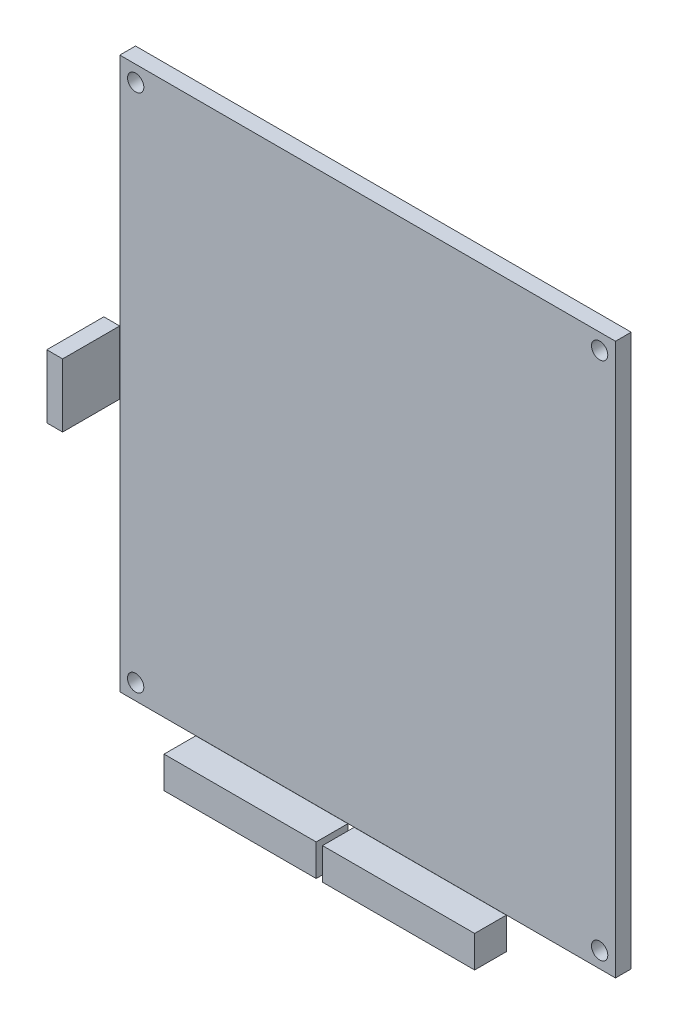
ISO-10303-21;
HEADER;
FILE_DESCRIPTION(('STEP AP214'),'2;1');
FILE_NAME('part.step','',(''),(''),'','','');
FILE_SCHEMA(('AUTOMOTIVE_DESIGN { 1 0 10303 214 1 1 1 1 }'));
ENDSEC;
DATA;
#1=APPLICATION_CONTEXT('core data for automotive mechanical design processes');
#2=APPLICATION_PROTOCOL_DEFINITION('international standard','automotive_design',2000,#1);
#3=PRODUCT_CONTEXT('',#1,'mechanical');
#4=PRODUCT('Part','Part','',(#3));
#5=PRODUCT_RELATED_PRODUCT_CATEGORY('part','',(#4));
#6=PRODUCT_DEFINITION_FORMATION('','',#4);
#7=PRODUCT_DEFINITION_CONTEXT('part definition',#1,'design');
#8=PRODUCT_DEFINITION('design','',#6,#7);
#9=PRODUCT_DEFINITION_SHAPE('','',#8);
#10=(LENGTH_UNIT() NAMED_UNIT(*) SI_UNIT(.MILLI.,.METRE.));
#11=(NAMED_UNIT(*) PLANE_ANGLE_UNIT() SI_UNIT($,.RADIAN.));
#12=(NAMED_UNIT(*) SI_UNIT($,.STERADIAN.) SOLID_ANGLE_UNIT());
#13=UNCERTAINTY_MEASURE_WITH_UNIT(LENGTH_MEASURE(1.E-05),#10,'distance_accuracy_value','');
#14=(GEOMETRIC_REPRESENTATION_CONTEXT(3) GLOBAL_UNCERTAINTY_ASSIGNED_CONTEXT((#13)) GLOBAL_UNIT_ASSIGNED_CONTEXT((#10,
#11,#12)) REPRESENTATION_CONTEXT('',''));
#15=CARTESIAN_POINT('',(0.,0.,0.));
#16=DIRECTION('',(0.,0.,1.));
#17=DIRECTION('',(1.,0.,0.));
#18=AXIS2_PLACEMENT_3D('',#15,#16,#17);
#19=CARTESIAN_POINT('',(-52.832,8.25499999999999,3.175));
#20=DIRECTION('',(0.,0.,1.));
#21=DIRECTION('',(0.,-1.,0.));
#22=AXIS2_PLACEMENT_3D('',#19,#20,#21);
#23=PLANE('',#22);
#24=DIRECTION('',(0.,-1.,0.));
#25=VECTOR('',#24,1.);
#26=CARTESIAN_POINT('',(-49.657,8.25499999999999,3.175));
#27=LINE('',#26,#25);
#28=CARTESIAN_POINT('',(-49.657,8.25499999999999,3.175));
#29=VERTEX_POINT('',#28);
#30=CARTESIAN_POINT('',(-49.657,-4.445,3.175));
#31=VERTEX_POINT('',#30);
#32=EDGE_CURVE('E108',#29,#31,#27,.T.);
#33=ORIENTED_EDGE('',*,*,#32,.T.);
#34=DIRECTION('',(1.,0.,0.));
#35=VECTOR('',#34,1.);
#36=CARTESIAN_POINT('',(-52.832,-4.445,3.175));
#37=LINE('',#36,#35);
#38=CARTESIAN_POINT('',(-52.832,-4.445,3.175));
#39=VERTEX_POINT('',#38);
#40=EDGE_CURVE('E12',#39,#31,#37,.T.);
#41=ORIENTED_EDGE('',*,*,#40,.F.);
#42=DIRECTION('',(0.,-1.,0.));
#43=VECTOR('',#42,1.);
#44=CARTESIAN_POINT('',(-52.832,8.25499999999999,3.175));
#45=LINE('',#44,#43);
#46=CARTESIAN_POINT('',(-52.832,8.25499999999999,3.175));
#47=VERTEX_POINT('',#46);
#48=EDGE_CURVE('E96',#47,#39,#45,.T.);
#49=ORIENTED_EDGE('',*,*,#48,.F.);
#50=DIRECTION('',(1.,0.,0.));
#51=VECTOR('',#50,1.);
#52=CARTESIAN_POINT('',(-52.832,8.25499999999999,3.175));
#53=LINE('',#52,#51);
#54=EDGE_CURVE('E104',#47,#29,#53,.T.);
#55=ORIENTED_EDGE('',*,*,#54,.T.);
#56=EDGE_LOOP('',(#33,#41,#49,#55));
#57=FACE_BOUND('',#56,.T.);
#58=ADVANCED_FACE('F45',(#57),#23,.F.);
#59=CARTESIAN_POINT('',(-52.832,-4.445,3.175));
#60=DIRECTION('',(0.,1.,0.));
#61=DIRECTION('',(0.,0.,1.));
#62=AXIS2_PLACEMENT_3D('',#59,#60,#61);
#63=PLANE('',#62);
#64=DIRECTION('',(0.,0.,1.));
#65=VECTOR('',#64,1.);
#66=CARTESIAN_POINT('',(-49.657,-4.445,3.175));
#67=LINE('',#66,#65);
#68=CARTESIAN_POINT('',(-49.657,-4.445,14.605));
#69=VERTEX_POINT('',#68);
#70=EDGE_CURVE('E100',#31,#69,#67,.T.);
#71=ORIENTED_EDGE('',*,*,#70,.T.);
#72=DIRECTION('',(1.,0.,0.));
#73=VECTOR('',#72,1.);
#74=CARTESIAN_POINT('',(-52.832,-4.445,14.605));
#75=LINE('',#74,#73);
#76=CARTESIAN_POINT('',(-52.832,-4.445,14.605));
#77=VERTEX_POINT('',#76);
#78=EDGE_CURVE('E53',#77,#69,#75,.T.);
#79=ORIENTED_EDGE('',*,*,#78,.F.);
#80=DIRECTION('',(0.,0.,1.));
#81=VECTOR('',#80,1.);
#82=CARTESIAN_POINT('',(-52.832,-4.445,3.175));
#83=LINE('',#82,#81);
#84=EDGE_CURVE('E91',#39,#77,#83,.T.);
#85=ORIENTED_EDGE('',*,*,#84,.F.);
#86=ORIENTED_EDGE('',*,*,#40,.T.);
#87=EDGE_LOOP('',(#71,#79,#85,#86));
#88=FACE_BOUND('',#87,.T.);
#89=ADVANCED_FACE('F99',(#88),#63,.F.);
#90=CARTESIAN_POINT('',(-52.832,8.255,14.605));
#91=DIRECTION('',(0.,0.,-1.));
#92=DIRECTION('',(0.,1.,0.));
#93=AXIS2_PLACEMENT_3D('',#90,#91,#92);
#94=PLANE('',#93);
#95=DIRECTION('',(0.,1.,0.));
#96=VECTOR('',#95,1.);
#97=CARTESIAN_POINT('',(-49.657,8.255,14.605));
#98=LINE('',#97,#96);
#99=CARTESIAN_POINT('',(-49.657,8.255,14.605));
#100=VERTEX_POINT('',#99);
#101=EDGE_CURVE('E78',#69,#100,#98,.T.);
#102=ORIENTED_EDGE('',*,*,#101,.T.);
#103=DIRECTION('',(1.,0.,0.));
#104=VECTOR('',#103,1.);
#105=CARTESIAN_POINT('',(-52.832,8.255,14.605));
#106=LINE('',#105,#104);
#107=CARTESIAN_POINT('',(-52.832,8.255,14.605));
#108=VERTEX_POINT('',#107);
#109=EDGE_CURVE('E101',#108,#100,#106,.T.);
#110=ORIENTED_EDGE('',*,*,#109,.F.);
#111=DIRECTION('',(0.,1.,0.));
#112=VECTOR('',#111,1.);
#113=CARTESIAN_POINT('',(-52.832,8.255,14.605));
#114=LINE('',#113,#112);
#115=EDGE_CURVE('E94',#77,#108,#114,.T.);
#116=ORIENTED_EDGE('',*,*,#115,.F.);
#117=ORIENTED_EDGE('',*,*,#78,.T.);
#118=EDGE_LOOP('',(#102,#110,#116,#117));
#119=FACE_BOUND('',#118,.T.);
#120=ADVANCED_FACE('F102',(#119),#94,.F.);
#121=CARTESIAN_POINT('',(-52.832,8.25499999999999,3.175));
#122=DIRECTION('',(0.,-1.,0.));
#123=DIRECTION('',(0.,0.,-1.));
#124=AXIS2_PLACEMENT_3D('',#121,#122,#123);
#125=PLANE('',#124);
#126=DIRECTION('',(0.,0.,-1.));
#127=VECTOR('',#126,1.);
#128=CARTESIAN_POINT('',(-49.657,8.25499999999999,3.175));
#129=LINE('',#128,#127);
#130=EDGE_CURVE('E84',#100,#29,#129,.T.);
#131=ORIENTED_EDGE('',*,*,#130,.T.);
#132=ORIENTED_EDGE('',*,*,#54,.F.);
#133=DIRECTION('',(0.,0.,-1.));
#134=VECTOR('',#133,1.);
#135=CARTESIAN_POINT('',(-52.832,8.25499999999999,3.175));
#136=LINE('',#135,#134);
#137=EDGE_CURVE('E61',#108,#47,#136,.T.);
#138=ORIENTED_EDGE('',*,*,#137,.F.);
#139=ORIENTED_EDGE('',*,*,#109,.T.);
#140=EDGE_LOOP('',(#131,#132,#138,#139));
#141=FACE_BOUND('',#140,.T.);
#142=ADVANCED_FACE('F115',(#141),#125,.F.);
#143=CARTESIAN_POINT('',(-52.832,-4.445,3.175));
#144=DIRECTION('',(-1.,0.,0.));
#145=DIRECTION('',(0.,0.,1.));
#146=AXIS2_PLACEMENT_3D('',#143,#144,#145);
#147=PLANE('',#146);
#148=ORIENTED_EDGE('',*,*,#48,.T.);
#149=ORIENTED_EDGE('',*,*,#84,.T.);
#150=ORIENTED_EDGE('',*,*,#115,.T.);
#151=ORIENTED_EDGE('',*,*,#137,.T.);
#152=EDGE_LOOP('',(#148,#149,#150,#151));
#153=FACE_BOUND('',#152,.T.);
#154=ADVANCED_FACE('F92',(#153),#147,.T.);
#155=CARTESIAN_POINT('',(-49.657,-4.445,3.175));
#156=DIRECTION('',(-1.,0.,0.));
#157=DIRECTION('',(0.,0.,1.));
#158=AXIS2_PLACEMENT_3D('',#155,#156,#157);
#159=PLANE('',#158);
#160=ORIENTED_EDGE('',*,*,#32,.F.);
#161=ORIENTED_EDGE('',*,*,#130,.F.);
#162=ORIENTED_EDGE('',*,*,#101,.F.);
#163=ORIENTED_EDGE('',*,*,#70,.F.);
#164=EDGE_LOOP('',(#160,#161,#162,#163));
#165=FACE_BOUND('',#164,.T.);
#166=ADVANCED_FACE('F118',(#165),#159,.F.);
#167=CLOSED_SHELL('',(#58,#89,#120,#142,#154,#166));
#168=MANIFOLD_SOLID_BREP('B2',#167);
#169=CARTESIAN_POINT('',(-2.667,-61.595,9.525));
#170=DIRECTION('',(1.,0.,0.));
#171=DIRECTION('',(0.,0.,-1.));
#172=AXIS2_PLACEMENT_3D('',#169,#170,#171);
#173=PLANE('',#172);
#174=DIRECTION('',(0.,0.,-1.));
#175=VECTOR('',#174,1.);
#176=CARTESIAN_POINT('',(-2.667,-55.245,9.525));
#177=LINE('',#176,#175);
#178=CARTESIAN_POINT('',(-2.667,-55.245,9.525));
#179=VERTEX_POINT('',#178);
#180=CARTESIAN_POINT('',(-2.66699999999999,-55.245,3.175));
#181=VERTEX_POINT('',#180);
#182=EDGE_CURVE('E243',#179,#181,#177,.T.);
#183=ORIENTED_EDGE('',*,*,#182,.T.);
#184=DIRECTION('',(0.,1.,0.));
#185=VECTOR('',#184,1.);
#186=CARTESIAN_POINT('',(-2.66699999999999,-61.595,3.175));
#187=LINE('',#186,#185);
#188=CARTESIAN_POINT('',(-2.66699999999999,-61.595,3.175));
#189=VERTEX_POINT('',#188);
#190=EDGE_CURVE('E43',#189,#181,#187,.T.);
#191=ORIENTED_EDGE('',*,*,#190,.F.);
#192=DIRECTION('',(0.,0.,-1.));
#193=VECTOR('',#192,1.);
#194=CARTESIAN_POINT('',(-2.667,-61.595,9.525));
#195=LINE('',#194,#193);
#196=CARTESIAN_POINT('',(-2.667,-61.595,9.525));
#197=VERTEX_POINT('',#196);
#198=EDGE_CURVE('E231',#197,#189,#195,.T.);
#199=ORIENTED_EDGE('',*,*,#198,.F.);
#200=DIRECTION('',(0.,1.,0.));
#201=VECTOR('',#200,1.);
#202=CARTESIAN_POINT('',(-2.667,-61.595,9.525));
#203=LINE('',#202,#201);
#204=EDGE_CURVE('E239',#197,#179,#203,.T.);
#205=ORIENTED_EDGE('',*,*,#204,.T.);
#206=EDGE_LOOP('',(#183,#191,#199,#205));
#207=FACE_BOUND('',#206,.T.);
#208=ADVANCED_FACE('F180',(#207),#173,.F.);
#209=CARTESIAN_POINT('',(-2.66699999999999,-61.595,3.175));
#210=DIRECTION('',(0.,0.,1.));
#211=DIRECTION('',(1.,0.,0.));
#212=AXIS2_PLACEMENT_3D('',#209,#210,#211);
#213=PLANE('',#212);
#214=DIRECTION('',(1.,0.,0.));
#215=VECTOR('',#214,1.);
#216=CARTESIAN_POINT('',(-2.66699999999999,-55.245,3.175));
#217=LINE('',#216,#215);
#218=CARTESIAN_POINT('',(27.813,-55.245,3.175));
#219=VERTEX_POINT('',#218);
#220=EDGE_CURVE('E235',#181,#219,#217,.T.);
#221=ORIENTED_EDGE('',*,*,#220,.T.);
#222=DIRECTION('',(0.,1.,0.));
#223=VECTOR('',#222,1.);
#224=CARTESIAN_POINT('',(27.813,-61.595,3.175));
#225=LINE('',#224,#223);
#226=CARTESIAN_POINT('',(27.813,-61.595,3.175));
#227=VERTEX_POINT('',#226);
#228=EDGE_CURVE('E188',#227,#219,#225,.T.);
#229=ORIENTED_EDGE('',*,*,#228,.F.);
#230=DIRECTION('',(1.,0.,0.));
#231=VECTOR('',#230,1.);
#232=CARTESIAN_POINT('',(-2.66699999999999,-61.595,3.175));
#233=LINE('',#232,#231);
#234=EDGE_CURVE('E226',#189,#227,#233,.T.);
#235=ORIENTED_EDGE('',*,*,#234,.F.);
#236=ORIENTED_EDGE('',*,*,#190,.T.);
#237=EDGE_LOOP('',(#221,#229,#235,#236));
#238=FACE_BOUND('',#237,.T.);
#239=ADVANCED_FACE('F234',(#238),#213,.F.);
#240=CARTESIAN_POINT('',(27.813,-61.595,9.525));
#241=DIRECTION('',(-1.,0.,0.));
#242=DIRECTION('',(0.,0.,1.));
#243=AXIS2_PLACEMENT_3D('',#240,#241,#242);
#244=PLANE('',#243);
#245=DIRECTION('',(0.,0.,1.));
#246=VECTOR('',#245,1.);
#247=CARTESIAN_POINT('',(27.813,-55.245,9.525));
#248=LINE('',#247,#246);
#249=CARTESIAN_POINT('',(27.813,-55.245,9.525));
#250=VERTEX_POINT('',#249);
#251=EDGE_CURVE('E213',#219,#250,#248,.T.);
#252=ORIENTED_EDGE('',*,*,#251,.T.);
#253=DIRECTION('',(0.,1.,0.));
#254=VECTOR('',#253,1.);
#255=CARTESIAN_POINT('',(27.813,-61.595,9.525));
#256=LINE('',#255,#254);
#257=CARTESIAN_POINT('',(27.813,-61.595,9.525));
#258=VERTEX_POINT('',#257);
#259=EDGE_CURVE('E236',#258,#250,#256,.T.);
#260=ORIENTED_EDGE('',*,*,#259,.F.);
#261=DIRECTION('',(0.,0.,1.));
#262=VECTOR('',#261,1.);
#263=CARTESIAN_POINT('',(27.813,-61.595,9.525));
#264=LINE('',#263,#262);
#265=EDGE_CURVE('E229',#227,#258,#264,.T.);
#266=ORIENTED_EDGE('',*,*,#265,.F.);
#267=ORIENTED_EDGE('',*,*,#228,.T.);
#268=EDGE_LOOP('',(#252,#260,#266,#267));
#269=FACE_BOUND('',#268,.T.);
#270=ADVANCED_FACE('F237',(#269),#244,.F.);
#271=CARTESIAN_POINT('',(-2.667,-61.595,9.525));
#272=DIRECTION('',(0.,0.,-1.));
#273=DIRECTION('',(-1.,0.,0.));
#274=AXIS2_PLACEMENT_3D('',#271,#272,#273);
#275=PLANE('',#274);
#276=DIRECTION('',(-1.,0.,0.));
#277=VECTOR('',#276,1.);
#278=CARTESIAN_POINT('',(-2.667,-55.245,9.525));
#279=LINE('',#278,#277);
#280=EDGE_CURVE('E219',#250,#179,#279,.T.);
#281=ORIENTED_EDGE('',*,*,#280,.T.);
#282=ORIENTED_EDGE('',*,*,#204,.F.);
#283=DIRECTION('',(-1.,0.,0.));
#284=VECTOR('',#283,1.);
#285=CARTESIAN_POINT('',(-2.667,-61.595,9.525));
#286=LINE('',#285,#284);
#287=EDGE_CURVE('E196',#258,#197,#286,.T.);
#288=ORIENTED_EDGE('',*,*,#287,.F.);
#289=ORIENTED_EDGE('',*,*,#259,.T.);
#290=EDGE_LOOP('',(#281,#282,#288,#289));
#291=FACE_BOUND('',#290,.T.);
#292=ADVANCED_FACE('F250',(#291),#275,.F.);
#293=CARTESIAN_POINT('',(-2.66699999999999,-61.595,3.175));
#294=DIRECTION('',(0.,-1.,0.));
#295=DIRECTION('',(0.,0.,-1.));
#296=AXIS2_PLACEMENT_3D('',#293,#294,#295);
#297=PLANE('',#296);
#298=ORIENTED_EDGE('',*,*,#198,.T.);
#299=ORIENTED_EDGE('',*,*,#234,.T.);
#300=ORIENTED_EDGE('',*,*,#265,.T.);
#301=ORIENTED_EDGE('',*,*,#287,.T.);
#302=EDGE_LOOP('',(#298,#299,#300,#301));
#303=FACE_BOUND('',#302,.T.);
#304=ADVANCED_FACE('F227',(#303),#297,.T.);
#305=CARTESIAN_POINT('',(-2.66699999999999,-55.245,3.175));
#306=DIRECTION('',(0.,-1.,0.));
#307=DIRECTION('',(0.,0.,-1.));
#308=AXIS2_PLACEMENT_3D('',#305,#306,#307);
#309=PLANE('',#308);
#310=ORIENTED_EDGE('',*,*,#182,.F.);
#311=ORIENTED_EDGE('',*,*,#280,.F.);
#312=ORIENTED_EDGE('',*,*,#251,.F.);
#313=ORIENTED_EDGE('',*,*,#220,.F.);
#314=EDGE_LOOP('',(#310,#311,#312,#313));
#315=FACE_BOUND('',#314,.T.);
#316=ADVANCED_FACE('F253',(#315),#309,.F.);
#317=CLOSED_SHELL('',(#208,#239,#270,#292,#304,#316));
#318=MANIFOLD_SOLID_BREP('B6',#317);
#319=CARTESIAN_POINT('',(-34.417,-61.595,9.525));
#320=DIRECTION('',(1.,0.,0.));
#321=DIRECTION('',(0.,0.,-1.));
#322=AXIS2_PLACEMENT_3D('',#319,#320,#321);
#323=PLANE('',#322);
#324=DIRECTION('',(0.,0.,-1.));
#325=VECTOR('',#324,1.);
#326=CARTESIAN_POINT('',(-34.417,-55.245,9.525));
#327=LINE('',#326,#325);
#328=CARTESIAN_POINT('',(-34.417,-55.245,9.525));
#329=VERTEX_POINT('',#328);
#330=CARTESIAN_POINT('',(-34.417,-55.245,3.175));
#331=VERTEX_POINT('',#330);
#332=EDGE_CURVE('E377',#329,#331,#327,.T.);
#333=ORIENTED_EDGE('',*,*,#332,.T.);
#334=DIRECTION('',(0.,1.,0.));
#335=VECTOR('',#334,1.);
#336=CARTESIAN_POINT('',(-34.417,-61.595,3.175));
#337=LINE('',#336,#335);
#338=CARTESIAN_POINT('',(-34.417,-61.595,3.175));
#339=VERTEX_POINT('',#338);
#340=EDGE_CURVE('E178',#339,#331,#337,.T.);
#341=ORIENTED_EDGE('',*,*,#340,.F.);
#342=DIRECTION('',(0.,0.,-1.));
#343=VECTOR('',#342,1.);
#344=CARTESIAN_POINT('',(-34.417,-61.595,9.525));
#345=LINE('',#344,#343);
#346=CARTESIAN_POINT('',(-34.417,-61.595,9.525));
#347=VERTEX_POINT('',#346);
#348=EDGE_CURVE('E365',#347,#339,#345,.T.);
#349=ORIENTED_EDGE('',*,*,#348,.F.);
#350=DIRECTION('',(0.,1.,0.));
#351=VECTOR('',#350,1.);
#352=CARTESIAN_POINT('',(-34.417,-61.595,9.525));
#353=LINE('',#352,#351);
#354=EDGE_CURVE('E373',#347,#329,#353,.T.);
#355=ORIENTED_EDGE('',*,*,#354,.T.);
#356=EDGE_LOOP('',(#333,#341,#349,#355));
#357=FACE_BOUND('',#356,.T.);
#358=ADVANCED_FACE('F314',(#357),#323,.F.);
#359=CARTESIAN_POINT('',(-34.417,-61.595,3.175));
#360=DIRECTION('',(0.,0.,1.));
#361=DIRECTION('',(1.,0.,0.));
#362=AXIS2_PLACEMENT_3D('',#359,#360,#361);
#363=PLANE('',#362);
#364=DIRECTION('',(1.,0.,0.));
#365=VECTOR('',#364,1.);
#366=CARTESIAN_POINT('',(-34.417,-55.245,3.175));
#367=LINE('',#366,#365);
#368=CARTESIAN_POINT('',(-3.93700000000001,-55.245,3.175));
#369=VERTEX_POINT('',#368);
#370=EDGE_CURVE('E369',#331,#369,#367,.T.);
#371=ORIENTED_EDGE('',*,*,#370,.T.);
#372=DIRECTION('',(0.,1.,0.));
#373=VECTOR('',#372,1.);
#374=CARTESIAN_POINT('',(-3.93700000000001,-61.595,3.175));
#375=LINE('',#374,#373);
#376=CARTESIAN_POINT('',(-3.93700000000001,-61.595,3.175));
#377=VERTEX_POINT('',#376);
#378=EDGE_CURVE('E322',#377,#369,#375,.T.);
#379=ORIENTED_EDGE('',*,*,#378,.F.);
#380=DIRECTION('',(1.,0.,0.));
#381=VECTOR('',#380,1.);
#382=CARTESIAN_POINT('',(-34.417,-61.595,3.175));
#383=LINE('',#382,#381);
#384=EDGE_CURVE('E360',#339,#377,#383,.T.);
#385=ORIENTED_EDGE('',*,*,#384,.F.);
#386=ORIENTED_EDGE('',*,*,#340,.T.);
#387=EDGE_LOOP('',(#371,#379,#385,#386));
#388=FACE_BOUND('',#387,.T.);
#389=ADVANCED_FACE('F368',(#388),#363,.F.);
#390=CARTESIAN_POINT('',(-3.93700000000001,-61.595,9.525));
#391=DIRECTION('',(-1.,0.,0.));
#392=DIRECTION('',(0.,0.,1.));
#393=AXIS2_PLACEMENT_3D('',#390,#391,#392);
#394=PLANE('',#393);
#395=DIRECTION('',(0.,0.,1.));
#396=VECTOR('',#395,1.);
#397=CARTESIAN_POINT('',(-3.93700000000001,-55.245,9.525));
#398=LINE('',#397,#396);
#399=CARTESIAN_POINT('',(-3.93700000000001,-55.245,9.525));
#400=VERTEX_POINT('',#399);
#401=EDGE_CURVE('E347',#369,#400,#398,.T.);
#402=ORIENTED_EDGE('',*,*,#401,.T.);
#403=DIRECTION('',(0.,1.,0.));
#404=VECTOR('',#403,1.);
#405=CARTESIAN_POINT('',(-3.93700000000001,-61.595,9.525));
#406=LINE('',#405,#404);
#407=CARTESIAN_POINT('',(-3.93700000000001,-61.595,9.525));
#408=VERTEX_POINT('',#407);
#409=EDGE_CURVE('E370',#408,#400,#406,.T.);
#410=ORIENTED_EDGE('',*,*,#409,.F.);
#411=DIRECTION('',(0.,0.,1.));
#412=VECTOR('',#411,1.);
#413=CARTESIAN_POINT('',(-3.93700000000001,-61.595,9.525));
#414=LINE('',#413,#412);
#415=EDGE_CURVE('E363',#377,#408,#414,.T.);
#416=ORIENTED_EDGE('',*,*,#415,.F.);
#417=ORIENTED_EDGE('',*,*,#378,.T.);
#418=EDGE_LOOP('',(#402,#410,#416,#417));
#419=FACE_BOUND('',#418,.T.);
#420=ADVANCED_FACE('F371',(#419),#394,.F.);
#421=CARTESIAN_POINT('',(-34.417,-61.595,9.525));
#422=DIRECTION('',(0.,0.,-1.));
#423=DIRECTION('',(-1.,0.,0.));
#424=AXIS2_PLACEMENT_3D('',#421,#422,#423);
#425=PLANE('',#424);
#426=DIRECTION('',(-1.,0.,0.));
#427=VECTOR('',#426,1.);
#428=CARTESIAN_POINT('',(-34.417,-55.245,9.525));
#429=LINE('',#428,#427);
#430=EDGE_CURVE('E353',#400,#329,#429,.T.);
#431=ORIENTED_EDGE('',*,*,#430,.T.);
#432=ORIENTED_EDGE('',*,*,#354,.F.);
#433=DIRECTION('',(-1.,0.,0.));
#434=VECTOR('',#433,1.);
#435=CARTESIAN_POINT('',(-34.417,-61.595,9.525));
#436=LINE('',#435,#434);
#437=EDGE_CURVE('E330',#408,#347,#436,.T.);
#438=ORIENTED_EDGE('',*,*,#437,.F.);
#439=ORIENTED_EDGE('',*,*,#409,.T.);
#440=EDGE_LOOP('',(#431,#432,#438,#439));
#441=FACE_BOUND('',#440,.T.);
#442=ADVANCED_FACE('F384',(#441),#425,.F.);
#443=CARTESIAN_POINT('',(-34.417,-61.595,3.175));
#444=DIRECTION('',(0.,-1.,0.));
#445=DIRECTION('',(0.,0.,-1.));
#446=AXIS2_PLACEMENT_3D('',#443,#444,#445);
#447=PLANE('',#446);
#448=ORIENTED_EDGE('',*,*,#348,.T.);
#449=ORIENTED_EDGE('',*,*,#384,.T.);
#450=ORIENTED_EDGE('',*,*,#415,.T.);
#451=ORIENTED_EDGE('',*,*,#437,.T.);
#452=EDGE_LOOP('',(#448,#449,#450,#451));
#453=FACE_BOUND('',#452,.T.);
#454=ADVANCED_FACE('F361',(#453),#447,.T.);
#455=CARTESIAN_POINT('',(-34.417,-55.245,3.175));
#456=DIRECTION('',(0.,-1.,0.));
#457=DIRECTION('',(0.,0.,-1.));
#458=AXIS2_PLACEMENT_3D('',#455,#456,#457);
#459=PLANE('',#458);
#460=ORIENTED_EDGE('',*,*,#332,.F.);
#461=ORIENTED_EDGE('',*,*,#430,.F.);
#462=ORIENTED_EDGE('',*,*,#401,.F.);
#463=ORIENTED_EDGE('',*,*,#370,.F.);
#464=EDGE_LOOP('',(#460,#461,#462,#463));
#465=FACE_BOUND('',#464,.T.);
#466=ADVANCED_FACE('F387',(#465),#459,.F.);
#467=CLOSED_SHELL('',(#358,#389,#420,#442,#454,#466));
#468=MANIFOLD_SOLID_BREP('B37',#467);
#469=CARTESIAN_POINT('',(49.657,-55.245,3.1496));
#470=DIRECTION('',(-1.,0.,0.));
#471=DIRECTION('',(0.,0.,1.));
#472=AXIS2_PLACEMENT_3D('',#469,#470,#471);
#473=PLANE('',#472);
#474=DIRECTION('',(0.,1.,0.));
#475=VECTOR('',#474,1.);
#476=CARTESIAN_POINT('',(49.657,-55.245,0.));
#477=LINE('',#476,#475);
#478=CARTESIAN_POINT('',(49.657,-55.245,0.));
#479=VERTEX_POINT('',#478);
#480=CARTESIAN_POINT('',(49.657,55.245,0.));
#481=VERTEX_POINT('',#480);
#482=EDGE_CURVE('E503',#479,#481,#477,.T.);
#483=ORIENTED_EDGE('',*,*,#482,.T.);
#484=DIRECTION('',(0.,0.,-1.));
#485=VECTOR('',#484,1.);
#486=CARTESIAN_POINT('',(49.657,55.245,3.1496));
#487=LINE('',#486,#485);
#488=CARTESIAN_POINT('',(49.657,55.245,3.1496));
#489=VERTEX_POINT('',#488);
#490=EDGE_CURVE('E312',#489,#481,#487,.T.);
#491=ORIENTED_EDGE('',*,*,#490,.F.);
#492=DIRECTION('',(0.,1.,0.));
#493=VECTOR('',#492,1.);
#494=CARTESIAN_POINT('',(49.657,-55.245,3.1496));
#495=LINE('',#494,#493);
#496=CARTESIAN_POINT('',(49.657,-55.245,3.1496));
#497=VERTEX_POINT('',#496);
#498=EDGE_CURVE('E491',#497,#489,#495,.T.);
#499=ORIENTED_EDGE('',*,*,#498,.F.);
#500=DIRECTION('',(0.,0.,-1.));
#501=VECTOR('',#500,1.);
#502=CARTESIAN_POINT('',(49.657,-55.245,3.1496));
#503=LINE('',#502,#501);
#504=EDGE_CURVE('E499',#497,#479,#503,.T.);
#505=ORIENTED_EDGE('',*,*,#504,.T.);
#506=EDGE_LOOP('',(#483,#491,#499,#505));
#507=FACE_BOUND('',#506,.T.);
#508=ADVANCED_FACE('F440',(#507),#473,.F.);
#509=CARTESIAN_POINT('',(-49.657,55.245,3.1496));
#510=DIRECTION('',(0.,-1.,0.));
#511=DIRECTION('',(0.,0.,-1.));
#512=AXIS2_PLACEMENT_3D('',#509,#510,#511);
#513=PLANE('',#512);
#514=DIRECTION('',(-1.,0.,0.));
#515=VECTOR('',#514,1.);
#516=CARTESIAN_POINT('',(-49.657,55.245,0.));
#517=LINE('',#516,#515);
#518=CARTESIAN_POINT('',(-49.657,55.245,0.));
#519=VERTEX_POINT('',#518);
#520=EDGE_CURVE('E495',#481,#519,#517,.T.);
#521=ORIENTED_EDGE('',*,*,#520,.T.);
#522=DIRECTION('',(0.,0.,-1.));
#523=VECTOR('',#522,1.);
#524=CARTESIAN_POINT('',(-49.657,55.245,3.1496));
#525=LINE('',#524,#523);
#526=CARTESIAN_POINT('',(-49.657,55.245,3.1496));
#527=VERTEX_POINT('',#526);
#528=EDGE_CURVE('E448',#527,#519,#525,.T.);
#529=ORIENTED_EDGE('',*,*,#528,.F.);
#530=DIRECTION('',(-1.,0.,0.));
#531=VECTOR('',#530,1.);
#532=CARTESIAN_POINT('',(-49.657,55.245,3.1496));
#533=LINE('',#532,#531);
#534=EDGE_CURVE('E486',#489,#527,#533,.T.);
#535=ORIENTED_EDGE('',*,*,#534,.F.);
#536=ORIENTED_EDGE('',*,*,#490,.T.);
#537=EDGE_LOOP('',(#521,#529,#535,#536));
#538=FACE_BOUND('',#537,.T.);
#539=ADVANCED_FACE('F494',(#538),#513,.F.);
#540=CARTESIAN_POINT('',(-49.657,-55.245,3.1496));
#541=DIRECTION('',(1.,0.,0.));
#542=DIRECTION('',(0.,0.,-1.));
#543=AXIS2_PLACEMENT_3D('',#540,#541,#542);
#544=PLANE('',#543);
#545=DIRECTION('',(0.,-1.,0.));
#546=VECTOR('',#545,1.);
#547=CARTESIAN_POINT('',(-49.657,-55.245,0.));
#548=LINE('',#547,#546);
#549=CARTESIAN_POINT('',(-49.657,-55.245,0.));
#550=VERTEX_POINT('',#549);
#551=EDGE_CURVE('E473',#519,#550,#548,.T.);
#552=ORIENTED_EDGE('',*,*,#551,.T.);
#553=DIRECTION('',(0.,0.,-1.));
#554=VECTOR('',#553,1.);
#555=CARTESIAN_POINT('',(-49.657,-55.245,3.1496));
#556=LINE('',#555,#554);
#557=CARTESIAN_POINT('',(-49.657,-55.245,3.1496));
#558=VERTEX_POINT('',#557);
#559=EDGE_CURVE('E496',#558,#550,#556,.T.);
#560=ORIENTED_EDGE('',*,*,#559,.F.);
#561=DIRECTION('',(0.,-1.,0.));
#562=VECTOR('',#561,1.);
#563=CARTESIAN_POINT('',(-49.657,-55.245,3.1496));
#564=LINE('',#563,#562);
#565=EDGE_CURVE('E489',#527,#558,#564,.T.);
#566=ORIENTED_EDGE('',*,*,#565,.F.);
#567=ORIENTED_EDGE('',*,*,#528,.T.);
#568=EDGE_LOOP('',(#552,#560,#566,#567));
#569=FACE_BOUND('',#568,.T.);
#570=ADVANCED_FACE('F497',(#569),#544,.F.);
#571=CARTESIAN_POINT('',(-49.657,-55.245,3.1496));
#572=DIRECTION('',(0.,1.,0.));
#573=DIRECTION('',(0.,0.,1.));
#574=AXIS2_PLACEMENT_3D('',#571,#572,#573);
#575=PLANE('',#574);
#576=DIRECTION('',(1.,0.,0.));
#577=VECTOR('',#576,1.);
#578=CARTESIAN_POINT('',(-49.657,-55.245,0.));
#579=LINE('',#578,#577);
#580=EDGE_CURVE('E479',#550,#479,#579,.T.);
#581=ORIENTED_EDGE('',*,*,#580,.T.);
#582=ORIENTED_EDGE('',*,*,#504,.F.);
#583=DIRECTION('',(1.,0.,0.));
#584=VECTOR('',#583,1.);
#585=CARTESIAN_POINT('',(-49.657,-55.245,3.1496));
#586=LINE('',#585,#584);
#587=EDGE_CURVE('E456',#558,#497,#586,.T.);
#588=ORIENTED_EDGE('',*,*,#587,.F.);
#589=ORIENTED_EDGE('',*,*,#559,.T.);
#590=EDGE_LOOP('',(#581,#582,#588,#589));
#591=FACE_BOUND('',#590,.T.);
#592=ADVANCED_FACE('F511',(#591),#575,.F.);
#593=CARTESIAN_POINT('',(49.657,55.245,3.1496));
#594=DIRECTION('',(0.,0.,-1.));
#595=DIRECTION('',(-1.,0.,0.));
#596=AXIS2_PLACEMENT_3D('',#593,#594,#595);
#597=PLANE('',#596);
#598=CARTESIAN_POINT('',(46.482,52.07,3.1496));
#599=DIRECTION('',(0.,0.,1.));
#600=DIRECTION('',(1.,0.,0.));
#601=AXIS2_PLACEMENT_3D('',#598,#599,#600);
#602=CIRCLE('',#601,1.63194999999999);
#603=CARTESIAN_POINT('',(48.11395,52.07,3.1496));
#604=VERTEX_POINT('',#603);
#605=EDGE_CURVE('E537',#604,#604,#602,.T.);
#606=ORIENTED_EDGE('',*,*,#605,.F.);
#607=EDGE_LOOP('',(#606));
#608=FACE_BOUND('',#607,.T.);
#609=CARTESIAN_POINT('',(46.482,-52.07,3.1496));
#610=DIRECTION('',(0.,0.,1.));
#611=DIRECTION('',(1.,0.,0.));
#612=AXIS2_PLACEMENT_3D('',#609,#610,#611);
#613=CIRCLE('',#612,1.63194999999999);
#614=CARTESIAN_POINT('',(48.11395,-52.07,3.1496));
#615=VERTEX_POINT('',#614);
#616=EDGE_CURVE('E531',#615,#615,#613,.T.);
#617=ORIENTED_EDGE('',*,*,#616,.F.);
#618=EDGE_LOOP('',(#617));
#619=FACE_BOUND('',#618,.T.);
#620=CARTESIAN_POINT('',(-46.482,52.07,3.1496));
#621=DIRECTION('',(0.,0.,1.));
#622=DIRECTION('',(1.,0.,0.));
#623=AXIS2_PLACEMENT_3D('',#620,#621,#622);
#624=CIRCLE('',#623,1.63194999999999);
#625=CARTESIAN_POINT('',(-44.85005,52.07,3.1496));
#626=VERTEX_POINT('',#625);
#627=EDGE_CURVE('E525',#626,#626,#624,.T.);
#628=ORIENTED_EDGE('',*,*,#627,.F.);
#629=EDGE_LOOP('',(#628));
#630=FACE_BOUND('',#629,.T.);
#631=CARTESIAN_POINT('',(-46.482,-52.07,3.1496));
#632=DIRECTION('',(0.,0.,1.));
#633=DIRECTION('',(1.,0.,0.));
#634=AXIS2_PLACEMENT_3D('',#631,#632,#633);
#635=CIRCLE('',#634,1.63194999999999);
#636=CARTESIAN_POINT('',(-44.85005,-52.07,3.1496));
#637=VERTEX_POINT('',#636);
#638=EDGE_CURVE('E519',#637,#637,#635,.T.);
#639=ORIENTED_EDGE('',*,*,#638,.F.);
#640=EDGE_LOOP('',(#639));
#641=FACE_BOUND('',#640,.T.);
#642=ORIENTED_EDGE('',*,*,#498,.T.);
#643=ORIENTED_EDGE('',*,*,#534,.T.);
#644=ORIENTED_EDGE('',*,*,#565,.T.);
#645=ORIENTED_EDGE('',*,*,#587,.T.);
#646=EDGE_LOOP('',(#642,#643,#644,#645));
#647=FACE_BOUND('',#646,.T.);
#648=ADVANCED_FACE('F487',(#608,#619,#630,#641,#647),#597,.F.);
#649=CARTESIAN_POINT('',(49.657,55.245,0.));
#650=DIRECTION('',(0.,0.,-1.));
#651=DIRECTION('',(-1.,0.,0.));
#652=AXIS2_PLACEMENT_3D('',#649,#650,#651);
#653=PLANE('',#652);
#654=CARTESIAN_POINT('',(46.482,52.07,0.));
#655=DIRECTION('',(0.,0.,1.));
#656=DIRECTION('',(1.,0.,0.));
#657=AXIS2_PLACEMENT_3D('',#654,#655,#656);
#658=CIRCLE('',#657,1.63195);
#659=CARTESIAN_POINT('',(48.11395,52.07,0.));
#660=VERTEX_POINT('',#659);
#661=EDGE_CURVE('E534',#660,#660,#658,.T.);
#662=ORIENTED_EDGE('',*,*,#661,.T.);
#663=EDGE_LOOP('',(#662));
#664=FACE_BOUND('',#663,.T.);
#665=CARTESIAN_POINT('',(46.482,-52.07,0.));
#666=DIRECTION('',(0.,0.,1.));
#667=DIRECTION('',(1.,0.,0.));
#668=AXIS2_PLACEMENT_3D('',#665,#666,#667);
#669=CIRCLE('',#668,1.63195);
#670=CARTESIAN_POINT('',(48.11395,-52.07,0.));
#671=VERTEX_POINT('',#670);
#672=EDGE_CURVE('E528',#671,#671,#669,.T.);
#673=ORIENTED_EDGE('',*,*,#672,.T.);
#674=EDGE_LOOP('',(#673));
#675=FACE_BOUND('',#674,.T.);
#676=CARTESIAN_POINT('',(-46.482,52.07,0.));
#677=DIRECTION('',(0.,0.,1.));
#678=DIRECTION('',(1.,0.,0.));
#679=AXIS2_PLACEMENT_3D('',#676,#677,#678);
#680=CIRCLE('',#679,1.63195);
#681=CARTESIAN_POINT('',(-44.85005,52.07,0.));
#682=VERTEX_POINT('',#681);
#683=EDGE_CURVE('E522',#682,#682,#680,.T.);
#684=ORIENTED_EDGE('',*,*,#683,.T.);
#685=EDGE_LOOP('',(#684));
#686=FACE_BOUND('',#685,.T.);
#687=CARTESIAN_POINT('',(-46.482,-52.07,0.));
#688=DIRECTION('',(0.,0.,1.));
#689=DIRECTION('',(1.,0.,0.));
#690=AXIS2_PLACEMENT_3D('',#687,#688,#689);
#691=CIRCLE('',#690,1.63195);
#692=CARTESIAN_POINT('',(-44.85005,-52.07,0.));
#693=VERTEX_POINT('',#692);
#694=EDGE_CURVE('E506',#693,#693,#691,.T.);
#695=ORIENTED_EDGE('',*,*,#694,.T.);
#696=EDGE_LOOP('',(#695));
#697=FACE_BOUND('',#696,.T.);
#698=ORIENTED_EDGE('',*,*,#482,.F.);
#699=ORIENTED_EDGE('',*,*,#580,.F.);
#700=ORIENTED_EDGE('',*,*,#551,.F.);
#701=ORIENTED_EDGE('',*,*,#520,.F.);
#702=EDGE_LOOP('',(#698,#699,#700,#701));
#703=FACE_BOUND('',#702,.T.);
#704=ADVANCED_FACE('F514',(#664,#675,#686,#697,#703),#653,.T.);
#705=CARTESIAN_POINT('',(-46.482,-52.07,3.1496));
#706=DIRECTION('',(0.,0.,1.));
#707=DIRECTION('',(1.,0.,0.));
#708=AXIS2_PLACEMENT_3D('',#705,#706,#707);
#709=CYLINDRICAL_SURFACE('',#708,1.63194999999999);
#710=ORIENTED_EDGE('',*,*,#694,.F.);
#711=EDGE_LOOP('',(#710));
#712=FACE_BOUND('',#711,.T.);
#713=ORIENTED_EDGE('',*,*,#638,.T.);
#714=EDGE_LOOP('',(#713));
#715=FACE_BOUND('',#714,.T.);
#716=ADVANCED_FACE('F552',(#712,#715),#709,.F.);
#717=CARTESIAN_POINT('',(-46.482,52.07,3.1496));
#718=DIRECTION('',(0.,0.,1.));
#719=DIRECTION('',(1.,0.,0.));
#720=AXIS2_PLACEMENT_3D('',#717,#718,#719);
#721=CYLINDRICAL_SURFACE('',#720,1.63194999999999);
#722=ORIENTED_EDGE('',*,*,#683,.F.);
#723=EDGE_LOOP('',(#722));
#724=FACE_BOUND('',#723,.T.);
#725=ORIENTED_EDGE('',*,*,#627,.T.);
#726=EDGE_LOOP('',(#725));
#727=FACE_BOUND('',#726,.T.);
#728=ADVANCED_FACE('F554',(#724,#727),#721,.F.);
#729=CARTESIAN_POINT('',(46.482,-52.07,3.1496));
#730=DIRECTION('',(0.,0.,1.));
#731=DIRECTION('',(1.,0.,0.));
#732=AXIS2_PLACEMENT_3D('',#729,#730,#731);
#733=CYLINDRICAL_SURFACE('',#732,1.63194999999999);
#734=ORIENTED_EDGE('',*,*,#672,.F.);
#735=EDGE_LOOP('',(#734));
#736=FACE_BOUND('',#735,.T.);
#737=ORIENTED_EDGE('',*,*,#616,.T.);
#738=EDGE_LOOP('',(#737));
#739=FACE_BOUND('',#738,.T.);
#740=ADVANCED_FACE('F561',(#736,#739),#733,.F.);
#741=CARTESIAN_POINT('',(46.482,52.07,3.1496));
#742=DIRECTION('',(0.,0.,1.));
#743=DIRECTION('',(1.,0.,0.));
#744=AXIS2_PLACEMENT_3D('',#741,#742,#743);
#745=CYLINDRICAL_SURFACE('',#744,1.63194999999999);
#746=ORIENTED_EDGE('',*,*,#661,.F.);
#747=EDGE_LOOP('',(#746));
#748=FACE_BOUND('',#747,.T.);
#749=ORIENTED_EDGE('',*,*,#605,.T.);
#750=EDGE_LOOP('',(#749));
#751=FACE_BOUND('',#750,.T.);
#752=ADVANCED_FACE('F541',(#748,#751),#745,.F.);
#753=CLOSED_SHELL('',(#508,#539,#570,#592,#648,#704,#716,#728,#740,#752));
#754=MANIFOLD_SOLID_BREP('B172',#753);
#755=ADVANCED_BREP_SHAPE_REPRESENTATION('',(#18,#168,#318,#468,#754),#14);
#756=SHAPE_DEFINITION_REPRESENTATION(#9,#755);
ENDSEC;
END-ISO-10303-21;
